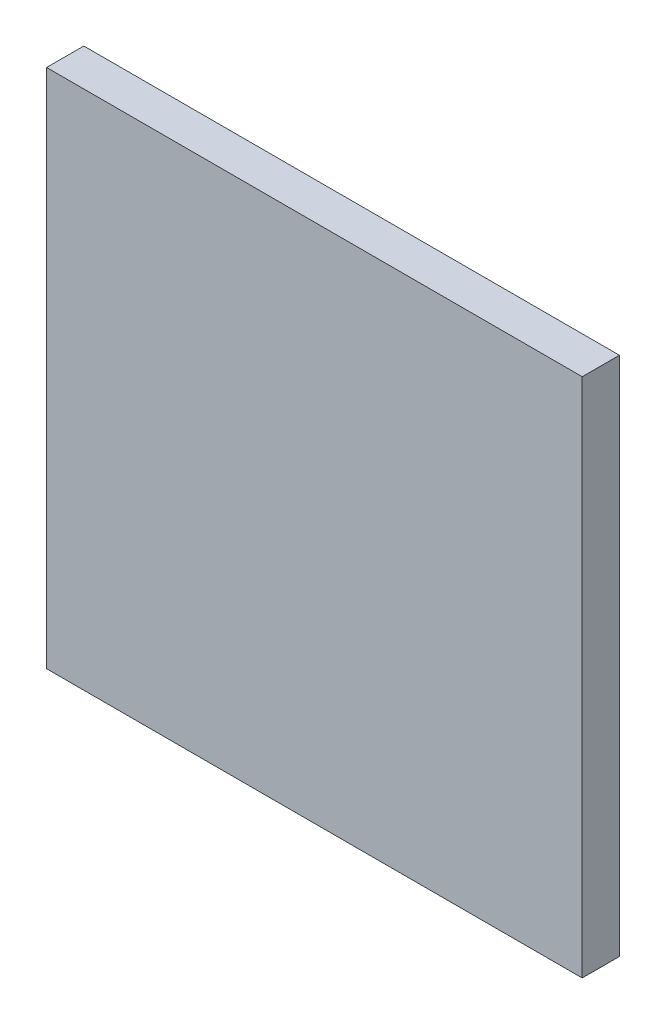
ISO-10303-21;
HEADER;
FILE_DESCRIPTION(('STEP AP214'),'2;1');
FILE_NAME('part.step','',(''),(''),'','','');
FILE_SCHEMA(('AUTOMOTIVE_DESIGN { 1 0 10303 214 1 1 1 1 }'));
ENDSEC;
DATA;
#1=APPLICATION_CONTEXT('core data for automotive mechanical design processes');
#2=APPLICATION_PROTOCOL_DEFINITION('international standard','automotive_design',2000,#1);
#3=PRODUCT_CONTEXT('',#1,'mechanical');
#4=PRODUCT('Part','Part','',(#3));
#5=PRODUCT_RELATED_PRODUCT_CATEGORY('part','',(#4));
#6=PRODUCT_DEFINITION_FORMATION('','',#4);
#7=PRODUCT_DEFINITION_CONTEXT('part definition',#1,'design');
#8=PRODUCT_DEFINITION('design','',#6,#7);
#9=PRODUCT_DEFINITION_SHAPE('','',#8);
#10=(LENGTH_UNIT() NAMED_UNIT(*) SI_UNIT(.MILLI.,.METRE.));
#11=(NAMED_UNIT(*) PLANE_ANGLE_UNIT() SI_UNIT($,.RADIAN.));
#12=(NAMED_UNIT(*) SI_UNIT($,.STERADIAN.) SOLID_ANGLE_UNIT());
#13=UNCERTAINTY_MEASURE_WITH_UNIT(LENGTH_MEASURE(1.E-05),#10,'distance_accuracy_value','');
#14=(GEOMETRIC_REPRESENTATION_CONTEXT(3) GLOBAL_UNCERTAINTY_ASSIGNED_CONTEXT((#13)) GLOBAL_UNIT_ASSIGNED_CONTEXT((#10,
#11,#12)) REPRESENTATION_CONTEXT('',''));
#15=CARTESIAN_POINT('',(0.,0.,0.));
#16=DIRECTION('',(0.,0.,1.));
#17=DIRECTION('',(1.,0.,0.));
#18=AXIS2_PLACEMENT_3D('',#15,#16,#17);
#19=CARTESIAN_POINT('',(-36.9395337995338,58.3746153846154,5.));
#20=DIRECTION('',(1.,0.,0.));
#21=DIRECTION('',(0.,0.,-1.));
#22=AXIS2_PLACEMENT_3D('',#19,#20,#21);
#23=PLANE('',#22);
#24=DIRECTION('',(0.,-1.,0.));
#25=VECTOR('',#24,1.);
#26=CARTESIAN_POINT('',(-36.9395337995338,58.3746153846154,0.));
#27=LINE('',#26,#25);
#28=CARTESIAN_POINT('',(-36.9395337995338,58.3746153846154,0.));
#29=VERTEX_POINT('',#28);
#30=CARTESIAN_POINT('',(-36.9395337995338,-11.6253846153846,0.));
#31=VERTEX_POINT('',#30);
#32=EDGE_CURVE('E93',#29,#31,#27,.T.);
#33=ORIENTED_EDGE('',*,*,#32,.T.);
#34=DIRECTION('',(0.,0.,-1.));
#35=VECTOR('',#34,1.);
#36=CARTESIAN_POINT('',(-36.9395337995338,-11.6253846153846,5.));
#37=LINE('',#36,#35);
#38=CARTESIAN_POINT('',(-36.9395337995338,-11.6253846153846,5.));
#39=VERTEX_POINT('',#38);
#40=EDGE_CURVE('E11',#39,#31,#37,.T.);
#41=ORIENTED_EDGE('',*,*,#40,.F.);
#42=DIRECTION('',(0.,-1.,0.));
#43=VECTOR('',#42,1.);
#44=CARTESIAN_POINT('',(-36.9395337995338,58.3746153846154,5.));
#45=LINE('',#44,#43);
#46=CARTESIAN_POINT('',(-36.9395337995338,58.3746153846154,5.));
#47=VERTEX_POINT('',#46);
#48=EDGE_CURVE('E81',#47,#39,#45,.T.);
#49=ORIENTED_EDGE('',*,*,#48,.F.);
#50=DIRECTION('',(0.,0.,-1.));
#51=VECTOR('',#50,1.);
#52=CARTESIAN_POINT('',(-36.9395337995338,58.3746153846154,5.));
#53=LINE('',#52,#51);
#54=EDGE_CURVE('E89',#47,#29,#53,.T.);
#55=ORIENTED_EDGE('',*,*,#54,.T.);
#56=EDGE_LOOP('',(#33,#41,#49,#55));
#57=FACE_BOUND('',#56,.T.);
#58=ADVANCED_FACE('F30',(#57),#23,.F.);
#59=CARTESIAN_POINT('',(-36.9395337995338,-11.6253846153846,5.));
#60=DIRECTION('',(0.,1.,0.));
#61=DIRECTION('',(0.,0.,1.));
#62=AXIS2_PLACEMENT_3D('',#59,#60,#61);
#63=PLANE('',#62);
#64=DIRECTION('',(1.,0.,0.));
#65=VECTOR('',#64,1.);
#66=CARTESIAN_POINT('',(-36.9395337995338,-11.6253846153846,0.));
#67=LINE('',#66,#65);
#68=CARTESIAN_POINT('',(35.0604662004662,-11.6253846153846,0.));
#69=VERTEX_POINT('',#68);
#70=EDGE_CURVE('E85',#31,#69,#67,.T.);
#71=ORIENTED_EDGE('',*,*,#70,.T.);
#72=DIRECTION('',(0.,0.,-1.));
#73=VECTOR('',#72,1.);
#74=CARTESIAN_POINT('',(35.0604662004662,-11.6253846153846,5.));
#75=LINE('',#74,#73);
#76=CARTESIAN_POINT('',(35.0604662004662,-11.6253846153846,5.));
#77=VERTEX_POINT('',#76);
#78=EDGE_CURVE('E38',#77,#69,#75,.T.);
#79=ORIENTED_EDGE('',*,*,#78,.F.);
#80=DIRECTION('',(1.,0.,0.));
#81=VECTOR('',#80,1.);
#82=CARTESIAN_POINT('',(-36.9395337995338,-11.6253846153846,5.));
#83=LINE('',#82,#81);
#84=EDGE_CURVE('E76',#39,#77,#83,.T.);
#85=ORIENTED_EDGE('',*,*,#84,.F.);
#86=ORIENTED_EDGE('',*,*,#40,.T.);
#87=EDGE_LOOP('',(#71,#79,#85,#86));
#88=FACE_BOUND('',#87,.T.);
#89=ADVANCED_FACE('F84',(#88),#63,.F.);
#90=CARTESIAN_POINT('',(35.0604662004662,58.3746153846154,5.));
#91=DIRECTION('',(-1.,0.,0.));
#92=DIRECTION('',(0.,-1.,0.));
#93=AXIS2_PLACEMENT_3D('',#90,#91,#92);
#94=PLANE('',#93);
#95=DIRECTION('',(0.,1.,0.));
#96=VECTOR('',#95,1.);
#97=CARTESIAN_POINT('',(35.0604662004662,58.3746153846154,0.));
#98=LINE('',#97,#96);
#99=CARTESIAN_POINT('',(35.0604662004662,58.3746153846154,0.));
#100=VERTEX_POINT('',#99);
#101=EDGE_CURVE('E63',#69,#100,#98,.T.);
#102=ORIENTED_EDGE('',*,*,#101,.T.);
#103=DIRECTION('',(0.,0.,-1.));
#104=VECTOR('',#103,1.);
#105=CARTESIAN_POINT('',(35.0604662004662,58.3746153846154,5.));
#106=LINE('',#105,#104);
#107=CARTESIAN_POINT('',(35.0604662004662,58.3746153846154,5.));
#108=VERTEX_POINT('',#107);
#109=EDGE_CURVE('E86',#108,#100,#106,.T.);
#110=ORIENTED_EDGE('',*,*,#109,.F.);
#111=DIRECTION('',(0.,1.,0.));
#112=VECTOR('',#111,1.);
#113=CARTESIAN_POINT('',(35.0604662004662,58.3746153846154,5.));
#114=LINE('',#113,#112);
#115=EDGE_CURVE('E79',#77,#108,#114,.T.);
#116=ORIENTED_EDGE('',*,*,#115,.F.);
#117=ORIENTED_EDGE('',*,*,#78,.T.);
#118=EDGE_LOOP('',(#102,#110,#116,#117));
#119=FACE_BOUND('',#118,.T.);
#120=ADVANCED_FACE('F87',(#119),#94,.F.);
#121=CARTESIAN_POINT('',(-36.9395337995338,58.3746153846154,5.));
#122=DIRECTION('',(0.,-1.,0.));
#123=DIRECTION('',(0.,0.,-1.));
#124=AXIS2_PLACEMENT_3D('',#121,#122,#123);
#125=PLANE('',#124);
#126=DIRECTION('',(-1.,0.,0.));
#127=VECTOR('',#126,1.);
#128=CARTESIAN_POINT('',(-36.9395337995338,58.3746153846154,0.));
#129=LINE('',#128,#127);
#130=EDGE_CURVE('E69',#100,#29,#129,.T.);
#131=ORIENTED_EDGE('',*,*,#130,.T.);
#132=ORIENTED_EDGE('',*,*,#54,.F.);
#133=DIRECTION('',(-1.,0.,0.));
#134=VECTOR('',#133,1.);
#135=CARTESIAN_POINT('',(-36.9395337995338,58.3746153846154,5.));
#136=LINE('',#135,#134);
#137=EDGE_CURVE('E46',#108,#47,#136,.T.);
#138=ORIENTED_EDGE('',*,*,#137,.F.);
#139=ORIENTED_EDGE('',*,*,#109,.T.);
#140=EDGE_LOOP('',(#131,#132,#138,#139));
#141=FACE_BOUND('',#140,.T.);
#142=ADVANCED_FACE('F100',(#141),#125,.F.);
#143=CARTESIAN_POINT('',(-36.9395337995338,-11.6253846153846,5.));
#144=DIRECTION('',(0.,0.,1.));
#145=DIRECTION('',(1.,0.,0.));
#146=AXIS2_PLACEMENT_3D('',#143,#144,#145);
#147=PLANE('',#146);
#148=ORIENTED_EDGE('',*,*,#48,.T.);
#149=ORIENTED_EDGE('',*,*,#84,.T.);
#150=ORIENTED_EDGE('',*,*,#115,.T.);
#151=ORIENTED_EDGE('',*,*,#137,.T.);
#152=EDGE_LOOP('',(#148,#149,#150,#151));
#153=FACE_BOUND('',#152,.T.);
#154=ADVANCED_FACE('F77',(#153),#147,.T.);
#155=CARTESIAN_POINT('',(-36.9395337995338,-11.6253846153846,0.));
#156=DIRECTION('',(0.,0.,1.));
#157=DIRECTION('',(1.,0.,0.));
#158=AXIS2_PLACEMENT_3D('',#155,#156,#157);
#159=PLANE('',#158);
#160=ORIENTED_EDGE('',*,*,#32,.F.);
#161=ORIENTED_EDGE('',*,*,#130,.F.);
#162=ORIENTED_EDGE('',*,*,#101,.F.);
#163=ORIENTED_EDGE('',*,*,#70,.F.);
#164=EDGE_LOOP('',(#160,#161,#162,#163));
#165=FACE_BOUND('',#164,.T.);
#166=ADVANCED_FACE('F103',(#165),#159,.F.);
#167=CLOSED_SHELL('',(#58,#89,#120,#142,#154,#166));
#168=MANIFOLD_SOLID_BREP('B2',#167);
#169=ADVANCED_BREP_SHAPE_REPRESENTATION('',(#18,#168),#14);
#170=SHAPE_DEFINITION_REPRESENTATION(#9,#169);
ENDSEC;
END-ISO-10303-21;
